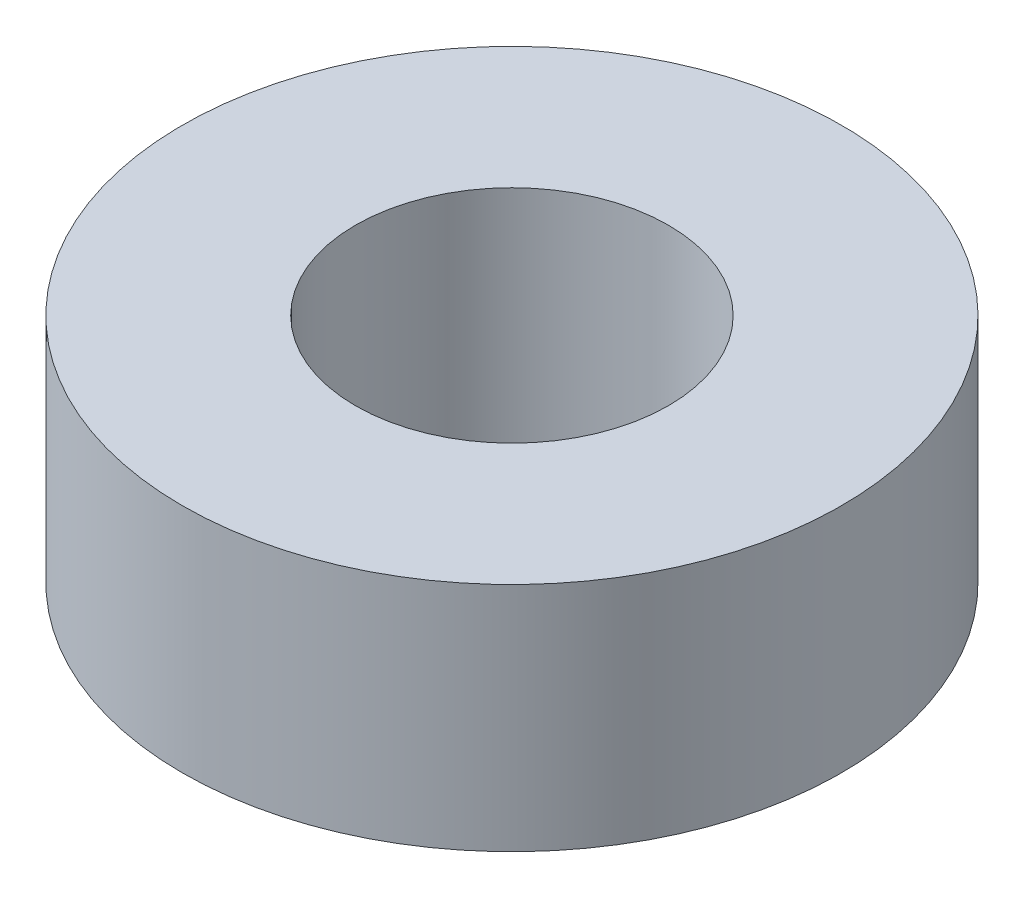
ISO-10303-21;
HEADER;
FILE_DESCRIPTION(('STEP AP214'),'2;1');
FILE_NAME('part.step','',(''),(''),'','','');
FILE_SCHEMA(('AUTOMOTIVE_DESIGN { 1 0 10303 214 1 1 1 1 }'));
ENDSEC;
DATA;
#1=APPLICATION_CONTEXT('core data for automotive mechanical design processes');
#2=APPLICATION_PROTOCOL_DEFINITION('international standard','automotive_design',2000,#1);
#3=PRODUCT_CONTEXT('',#1,'mechanical');
#4=PRODUCT('Part','Part','',(#3));
#5=PRODUCT_RELATED_PRODUCT_CATEGORY('part','',(#4));
#6=PRODUCT_DEFINITION_FORMATION('','',#4);
#7=PRODUCT_DEFINITION_CONTEXT('part definition',#1,'design');
#8=PRODUCT_DEFINITION('design','',#6,#7);
#9=PRODUCT_DEFINITION_SHAPE('','',#8);
#10=(LENGTH_UNIT() NAMED_UNIT(*) SI_UNIT(.MILLI.,.METRE.));
#11=(NAMED_UNIT(*) PLANE_ANGLE_UNIT() SI_UNIT($,.RADIAN.));
#12=(NAMED_UNIT(*) SI_UNIT($,.STERADIAN.) SOLID_ANGLE_UNIT());
#13=UNCERTAINTY_MEASURE_WITH_UNIT(LENGTH_MEASURE(1.E-05),#10,'distance_accuracy_value','');
#14=(GEOMETRIC_REPRESENTATION_CONTEXT(3) GLOBAL_UNCERTAINTY_ASSIGNED_CONTEXT((#13)) GLOBAL_UNIT_ASSIGNED_CONTEXT((#10,
#11,#12)) REPRESENTATION_CONTEXT('',''));
#15=CARTESIAN_POINT('',(0.,0.,0.));
#16=DIRECTION('',(0.,0.,1.));
#17=DIRECTION('',(1.,0.,0.));
#18=AXIS2_PLACEMENT_3D('',#15,#16,#17);
#19=CARTESIAN_POINT('',(0.,8.678,0.));
#20=DIRECTION('',(0.,-1.,0.));
#21=DIRECTION('',(0.,0.,-1.));
#22=AXIS2_PLACEMENT_3D('',#19,#20,#21);
#23=CYLINDRICAL_SURFACE('',#22,12.36);
#24=CARTESIAN_POINT('',(0.,8.678,0.));
#25=DIRECTION('',(0.,1.,0.));
#26=DIRECTION('',(0.,0.,1.));
#27=AXIS2_PLACEMENT_3D('',#24,#25,#26);
#28=CIRCLE('',#27,12.36);
#29=CARTESIAN_POINT('',(0.,8.678,12.36));
#30=VERTEX_POINT('',#29);
#31=EDGE_CURVE('E10',#30,#30,#28,.T.);
#32=ORIENTED_EDGE('',*,*,#31,.F.);
#33=EDGE_LOOP('',(#32));
#34=FACE_BOUND('',#33,.T.);
#35=CARTESIAN_POINT('',(0.,0.,0.));
#36=DIRECTION('',(0.,1.,0.));
#37=DIRECTION('',(0.,0.,1.));
#38=AXIS2_PLACEMENT_3D('',#35,#36,#37);
#39=CIRCLE('',#38,12.36);
#40=CARTESIAN_POINT('',(0.,0.,12.36));
#41=VERTEX_POINT('',#40);
#42=EDGE_CURVE('E46',#41,#41,#39,.T.);
#43=ORIENTED_EDGE('',*,*,#42,.T.);
#44=EDGE_LOOP('',(#43));
#45=FACE_BOUND('',#44,.T.);
#46=ADVANCED_FACE('F43',(#34,#45),#23,.T.);
#47=CARTESIAN_POINT('',(0.,8.678,0.));
#48=DIRECTION('',(0.,1.,0.));
#49=DIRECTION('',(0.,0.,1.));
#50=AXIS2_PLACEMENT_3D('',#47,#48,#49);
#51=PLANE('',#50);
#52=CARTESIAN_POINT('',(0.,8.678,0.));
#53=DIRECTION('',(0.,-1.,0.));
#54=DIRECTION('',(0.,0.,-1.));
#55=AXIS2_PLACEMENT_3D('',#52,#53,#54);
#56=CIRCLE('',#55,5.8674);
#57=CARTESIAN_POINT('',(0.,8.678,-5.8674));
#58=VERTEX_POINT('',#57);
#59=EDGE_CURVE('E55',#58,#58,#56,.T.);
#60=ORIENTED_EDGE('',*,*,#59,.T.);
#61=EDGE_LOOP('',(#60));
#62=FACE_BOUND('',#61,.T.);
#63=ORIENTED_EDGE('',*,*,#31,.T.);
#64=EDGE_LOOP('',(#63));
#65=FACE_BOUND('',#64,.T.);
#66=ADVANCED_FACE('F65',(#62,#65),#51,.T.);
#67=CARTESIAN_POINT('',(0.,0.,0.));
#68=DIRECTION('',(0.,1.,0.));
#69=DIRECTION('',(0.,0.,1.));
#70=AXIS2_PLACEMENT_3D('',#67,#68,#69);
#71=PLANE('',#70);
#72=CARTESIAN_POINT('',(0.,0.,0.));
#73=DIRECTION('',(0.,-1.,0.));
#74=DIRECTION('',(0.,0.,-1.));
#75=AXIS2_PLACEMENT_3D('',#72,#73,#74);
#76=CIRCLE('',#75,5.8674);
#77=CARTESIAN_POINT('',(0.,0.,-5.8674));
#78=VERTEX_POINT('',#77);
#79=EDGE_CURVE('E57',#78,#78,#76,.T.);
#80=ORIENTED_EDGE('',*,*,#79,.F.);
#81=EDGE_LOOP('',(#80));
#82=FACE_BOUND('',#81,.T.);
#83=ORIENTED_EDGE('',*,*,#42,.F.);
#84=EDGE_LOOP('',(#83));
#85=FACE_BOUND('',#84,.T.);
#86=ADVANCED_FACE('F70',(#82,#85),#71,.F.);
#87=CARTESIAN_POINT('',(0.,8.678,0.));
#88=DIRECTION('',(0.,-1.,0.));
#89=DIRECTION('',(0.,0.,-1.));
#90=AXIS2_PLACEMENT_3D('',#87,#88,#89);
#91=CYLINDRICAL_SURFACE('',#90,5.8674);
#92=ORIENTED_EDGE('',*,*,#59,.F.);
#93=EDGE_LOOP('',(#92));
#94=FACE_BOUND('',#93,.T.);
#95=ORIENTED_EDGE('',*,*,#79,.T.);
#96=EDGE_LOOP('',(#95));
#97=FACE_BOUND('',#96,.T.);
#98=ADVANCED_FACE('F67',(#94,#97),#91,.F.);
#99=CLOSED_SHELL('',(#46,#66,#86,#98));
#100=MANIFOLD_SOLID_BREP('B2',#99);
#101=ADVANCED_BREP_SHAPE_REPRESENTATION('',(#18,#100),#14);
#102=SHAPE_DEFINITION_REPRESENTATION(#9,#101);
ENDSEC;
END-ISO-10303-21;
